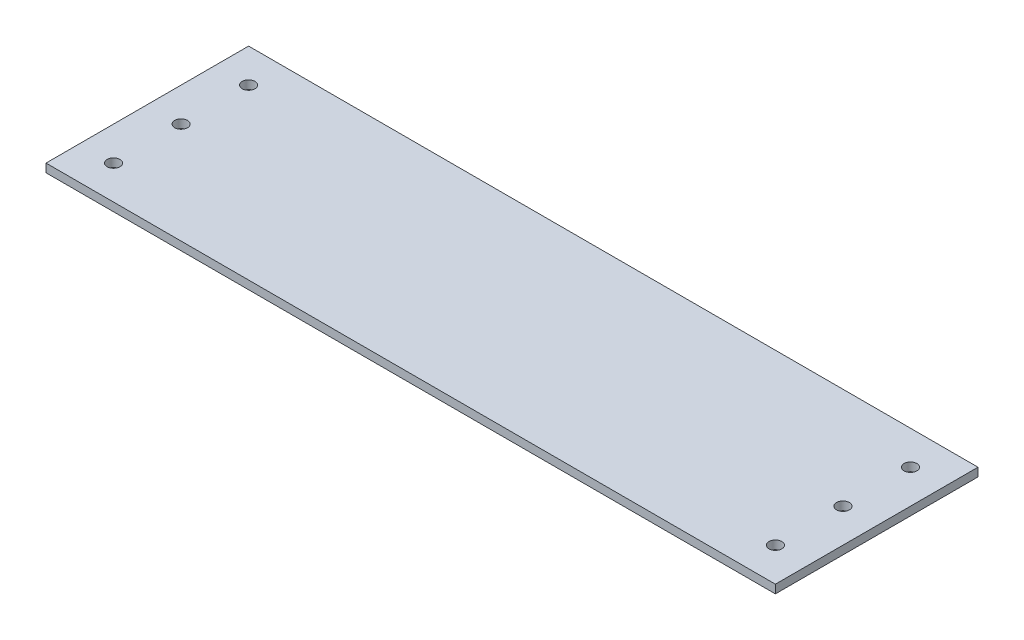
ISO-10303-21;
HEADER;
FILE_DESCRIPTION(('STEP AP214'),'2;1');
FILE_NAME('part.step','',(''),(''),'','','');
FILE_SCHEMA(('AUTOMOTIVE_DESIGN { 1 0 10303 214 1 1 1 1 }'));
ENDSEC;
DATA;
#1=APPLICATION_CONTEXT('core data for automotive mechanical design processes');
#2=APPLICATION_PROTOCOL_DEFINITION('international standard','automotive_design',2000,#1);
#3=PRODUCT_CONTEXT('',#1,'mechanical');
#4=PRODUCT('Part','Part','',(#3));
#5=PRODUCT_RELATED_PRODUCT_CATEGORY('part','',(#4));
#6=PRODUCT_DEFINITION_FORMATION('','',#4);
#7=PRODUCT_DEFINITION_CONTEXT('part definition',#1,'design');
#8=PRODUCT_DEFINITION('design','',#6,#7);
#9=PRODUCT_DEFINITION_SHAPE('','',#8);
#10=(LENGTH_UNIT() NAMED_UNIT(*) SI_UNIT(.MILLI.,.METRE.));
#11=(NAMED_UNIT(*) PLANE_ANGLE_UNIT() SI_UNIT($,.RADIAN.));
#12=(NAMED_UNIT(*) SI_UNIT($,.STERADIAN.) SOLID_ANGLE_UNIT());
#13=UNCERTAINTY_MEASURE_WITH_UNIT(LENGTH_MEASURE(1.E-05),#10,'distance_accuracy_value','');
#14=(GEOMETRIC_REPRESENTATION_CONTEXT(3) GLOBAL_UNCERTAINTY_ASSIGNED_CONTEXT((#13)) GLOBAL_UNIT_ASSIGNED_CONTEXT((#10,
#11,#12)) REPRESENTATION_CONTEXT('',''));
#15=CARTESIAN_POINT('',(0.,0.,0.));
#16=DIRECTION('',(0.,0.,1.));
#17=DIRECTION('',(1.,0.,0.));
#18=AXIS2_PLACEMENT_3D('',#15,#16,#17);
#19=CARTESIAN_POINT('',(0.,3.175,0.));
#20=DIRECTION('',(0.,-1.,0.));
#21=DIRECTION('',(0.,0.,-1.));
#22=AXIS2_PLACEMENT_3D('',#19,#20,#21);
#23=PLANE('',#22);
#24=DIRECTION('',(0.,0.,1.));
#25=VECTOR('',#24,1.);
#26=CARTESIAN_POINT('',(0.,3.175,0.));
#27=LINE('',#26,#25);
#28=CARTESIAN_POINT('',(0.,3.175,-76.2));
#29=VERTEX_POINT('',#28);
#30=CARTESIAN_POINT('',(0.,3.175,0.));
#31=VERTEX_POINT('',#30);
#32=EDGE_CURVE('E92',#29,#31,#27,.T.);
#33=ORIENTED_EDGE('',*,*,#32,.T.);
#34=DIRECTION('',(1.,0.,0.));
#35=VECTOR('',#34,1.);
#36=CARTESIAN_POINT('',(0.,3.175,0.));
#37=LINE('',#36,#35);
#38=CARTESIAN_POINT('',(274.32,3.175,0.));
#39=VERTEX_POINT('',#38);
#40=EDGE_CURVE('E87',#31,#39,#37,.T.);
#41=ORIENTED_EDGE('',*,*,#40,.T.);
#42=DIRECTION('',(0.,0.,-1.));
#43=VECTOR('',#42,1.);
#44=CARTESIAN_POINT('',(274.32,3.175,0.));
#45=LINE('',#44,#43);
#46=CARTESIAN_POINT('',(274.32,3.175,-76.2));
#47=VERTEX_POINT('',#46);
#48=EDGE_CURVE('E90',#39,#47,#45,.T.);
#49=ORIENTED_EDGE('',*,*,#48,.T.);
#50=DIRECTION('',(-1.,0.,0.));
#51=VECTOR('',#50,1.);
#52=CARTESIAN_POINT('',(0.,3.175,-76.2));
#53=LINE('',#52,#51);
#54=EDGE_CURVE('E57',#47,#29,#53,.T.);
#55=ORIENTED_EDGE('',*,*,#54,.T.);
#56=EDGE_LOOP('',(#33,#41,#49,#55));
#57=FACE_BOUND('',#56,.T.);
#58=CARTESIAN_POINT('',(12.7,3.175,-63.5));
#59=DIRECTION('',(0.,1.,0.));
#60=DIRECTION('',(0.,0.,1.));
#61=AXIS2_PLACEMENT_3D('',#58,#59,#60);
#62=CIRCLE('',#61,2.413);
#63=CARTESIAN_POINT('',(12.7,3.175,-61.087));
#64=VERTEX_POINT('',#63);
#65=EDGE_CURVE('E112',#64,#64,#62,.T.);
#66=ORIENTED_EDGE('',*,*,#65,.F.);
#67=EDGE_LOOP('',(#66));
#68=FACE_BOUND('',#67,.T.);
#69=CARTESIAN_POINT('',(12.7000000000003,3.175,-38.1));
#70=DIRECTION('',(0.,1.,0.));
#71=DIRECTION('',(0.,0.,1.));
#72=AXIS2_PLACEMENT_3D('',#69,#70,#71);
#73=CIRCLE('',#72,2.413);
#74=CARTESIAN_POINT('',(12.7000000000003,3.175,-35.687));
#75=VERTEX_POINT('',#74);
#76=EDGE_CURVE('E134',#75,#75,#73,.T.);
#77=ORIENTED_EDGE('',*,*,#76,.F.);
#78=EDGE_LOOP('',(#77));
#79=FACE_BOUND('',#78,.T.);
#80=CARTESIAN_POINT('',(12.7000000000005,3.175,-12.7));
#81=DIRECTION('',(0.,1.,0.));
#82=DIRECTION('',(0.,0.,1.));
#83=AXIS2_PLACEMENT_3D('',#80,#81,#82);
#84=CIRCLE('',#83,2.413);
#85=CARTESIAN_POINT('',(12.7000000000005,3.175,-10.287));
#86=VERTEX_POINT('',#85);
#87=EDGE_CURVE('E142',#86,#86,#84,.T.);
#88=ORIENTED_EDGE('',*,*,#87,.F.);
#89=EDGE_LOOP('',(#88));
#90=FACE_BOUND('',#89,.T.);
#91=CARTESIAN_POINT('',(261.619999999999,3.175,-12.7));
#92=DIRECTION('',(0.,1.,0.));
#93=DIRECTION('',(0.,0.,-1.));
#94=AXIS2_PLACEMENT_3D('',#91,#92,#93);
#95=CIRCLE('',#94,2.41299999999994);
#96=CARTESIAN_POINT('',(261.619999999999,3.175,-15.1129999999999));
#97=VERTEX_POINT('',#96);
#98=EDGE_CURVE('E150',#97,#97,#95,.T.);
#99=ORIENTED_EDGE('',*,*,#98,.F.);
#100=EDGE_LOOP('',(#99));
#101=FACE_BOUND('',#100,.T.);
#102=CARTESIAN_POINT('',(261.62,3.175,-38.1));
#103=DIRECTION('',(0.,1.,0.));
#104=DIRECTION('',(0.,0.,-1.));
#105=AXIS2_PLACEMENT_3D('',#102,#103,#104);
#106=CIRCLE('',#105,2.41299999999999);
#107=CARTESIAN_POINT('',(261.62,3.175,-40.513));
#108=VERTEX_POINT('',#107);
#109=EDGE_CURVE('E158',#108,#108,#106,.T.);
#110=ORIENTED_EDGE('',*,*,#109,.F.);
#111=EDGE_LOOP('',(#110));
#112=FACE_BOUND('',#111,.T.);
#113=CARTESIAN_POINT('',(261.62,3.175,-63.5));
#114=DIRECTION('',(0.,1.,0.));
#115=DIRECTION('',(0.,0.,-1.));
#116=AXIS2_PLACEMENT_3D('',#113,#114,#115);
#117=CIRCLE('',#116,2.41299999999999);
#118=CARTESIAN_POINT('',(261.62,3.175,-65.913));
#119=VERTEX_POINT('',#118);
#120=EDGE_CURVE('E166',#119,#119,#117,.T.);
#121=ORIENTED_EDGE('',*,*,#120,.F.);
#122=EDGE_LOOP('',(#121));
#123=FACE_BOUND('',#122,.T.);
#124=ADVANCED_FACE('F39',(#57,#68,#79,#90,#101,#112,#123),#23,.F.);
#125=CARTESIAN_POINT('',(0.,0.,0.));
#126=DIRECTION('',(0.,-1.,0.));
#127=DIRECTION('',(0.,0.,-1.));
#128=AXIS2_PLACEMENT_3D('',#125,#126,#127);
#129=PLANE('',#128);
#130=CARTESIAN_POINT('',(261.62,0.,-38.1));
#131=DIRECTION('',(0.,1.,0.));
#132=DIRECTION('',(0.,0.,-1.));
#133=AXIS2_PLACEMENT_3D('',#130,#131,#132);
#134=CIRCLE('',#133,2.41299999999999);
#135=CARTESIAN_POINT('',(261.62,0.,-40.513));
#136=VERTEX_POINT('',#135);
#137=EDGE_CURVE('E162',#136,#136,#134,.T.);
#138=ORIENTED_EDGE('',*,*,#137,.T.);
#139=EDGE_LOOP('',(#138));
#140=FACE_BOUND('',#139,.T.);
#141=CARTESIAN_POINT('',(12.7000000000005,0.,-12.7));
#142=DIRECTION('',(0.,1.,0.));
#143=DIRECTION('',(0.,0.,1.));
#144=AXIS2_PLACEMENT_3D('',#141,#142,#143);
#145=CIRCLE('',#144,2.413);
#146=CARTESIAN_POINT('',(12.7000000000005,0.,-10.287));
#147=VERTEX_POINT('',#146);
#148=EDGE_CURVE('E146',#147,#147,#145,.T.);
#149=ORIENTED_EDGE('',*,*,#148,.T.);
#150=EDGE_LOOP('',(#149));
#151=FACE_BOUND('',#150,.T.);
#152=CARTESIAN_POINT('',(12.7,0.,-63.5));
#153=DIRECTION('',(0.,1.,0.));
#154=DIRECTION('',(0.,0.,1.));
#155=AXIS2_PLACEMENT_3D('',#152,#153,#154);
#156=CIRCLE('',#155,2.413);
#157=CARTESIAN_POINT('',(12.7,0.,-61.087));
#158=VERTEX_POINT('',#157);
#159=EDGE_CURVE('E130',#158,#158,#156,.T.);
#160=ORIENTED_EDGE('',*,*,#159,.T.);
#161=EDGE_LOOP('',(#160));
#162=FACE_BOUND('',#161,.T.);
#163=DIRECTION('',(0.,0.,1.));
#164=VECTOR('',#163,1.);
#165=CARTESIAN_POINT('',(0.,0.,0.));
#166=LINE('',#165,#164);
#167=CARTESIAN_POINT('',(0.,0.,-76.2));
#168=VERTEX_POINT('',#167);
#169=CARTESIAN_POINT('',(0.,0.,0.));
#170=VERTEX_POINT('',#169);
#171=EDGE_CURVE('E108',#168,#170,#166,.T.);
#172=ORIENTED_EDGE('',*,*,#171,.F.);
#173=DIRECTION('',(-1.,0.,0.));
#174=VECTOR('',#173,1.);
#175=CARTESIAN_POINT('',(0.,0.,-76.2));
#176=LINE('',#175,#174);
#177=CARTESIAN_POINT('',(274.32,0.,-76.2));
#178=VERTEX_POINT('',#177);
#179=EDGE_CURVE('E80',#178,#168,#176,.T.);
#180=ORIENTED_EDGE('',*,*,#179,.F.);
#181=DIRECTION('',(0.,0.,-1.));
#182=VECTOR('',#181,1.);
#183=CARTESIAN_POINT('',(274.32,0.,0.));
#184=LINE('',#183,#182);
#185=CARTESIAN_POINT('',(274.32,0.,0.));
#186=VERTEX_POINT('',#185);
#187=EDGE_CURVE('E74',#186,#178,#184,.T.);
#188=ORIENTED_EDGE('',*,*,#187,.F.);
#189=DIRECTION('',(1.,0.,0.));
#190=VECTOR('',#189,1.);
#191=CARTESIAN_POINT('',(0.,0.,0.));
#192=LINE('',#191,#190);
#193=EDGE_CURVE('E97',#170,#186,#192,.T.);
#194=ORIENTED_EDGE('',*,*,#193,.F.);
#195=EDGE_LOOP('',(#172,#180,#188,#194));
#196=FACE_BOUND('',#195,.T.);
#197=CARTESIAN_POINT('',(12.7000000000003,0.,-38.1));
#198=DIRECTION('',(0.,1.,0.));
#199=DIRECTION('',(0.,0.,1.));
#200=AXIS2_PLACEMENT_3D('',#197,#198,#199);
#201=CIRCLE('',#200,2.413);
#202=CARTESIAN_POINT('',(12.7000000000003,0.,-35.687));
#203=VERTEX_POINT('',#202);
#204=EDGE_CURVE('E138',#203,#203,#201,.T.);
#205=ORIENTED_EDGE('',*,*,#204,.T.);
#206=EDGE_LOOP('',(#205));
#207=FACE_BOUND('',#206,.T.);
#208=CARTESIAN_POINT('',(261.619999999999,0.,-12.7));
#209=DIRECTION('',(0.,1.,0.));
#210=DIRECTION('',(0.,0.,-1.));
#211=AXIS2_PLACEMENT_3D('',#208,#209,#210);
#212=CIRCLE('',#211,2.41299999999994);
#213=CARTESIAN_POINT('',(261.619999999999,0.,-15.1129999999999));
#214=VERTEX_POINT('',#213);
#215=EDGE_CURVE('E154',#214,#214,#212,.T.);
#216=ORIENTED_EDGE('',*,*,#215,.T.);
#217=EDGE_LOOP('',(#216));
#218=FACE_BOUND('',#217,.T.);
#219=CARTESIAN_POINT('',(261.62,0.,-63.5));
#220=DIRECTION('',(0.,1.,0.));
#221=DIRECTION('',(0.,0.,-1.));
#222=AXIS2_PLACEMENT_3D('',#219,#220,#221);
#223=CIRCLE('',#222,2.41299999999999);
#224=CARTESIAN_POINT('',(261.62,0.,-65.913));
#225=VERTEX_POINT('',#224);
#226=EDGE_CURVE('E170',#225,#225,#223,.T.);
#227=ORIENTED_EDGE('',*,*,#226,.T.);
#228=EDGE_LOOP('',(#227));
#229=FACE_BOUND('',#228,.T.);
#230=ADVANCED_FACE('F125',(#140,#151,#162,#196,#207,#218,#229),#129,.T.);
#231=CARTESIAN_POINT('',(0.,3.175,0.));
#232=DIRECTION('',(1.,0.,0.));
#233=DIRECTION('',(0.,0.,-1.));
#234=AXIS2_PLACEMENT_3D('',#231,#232,#233);
#235=PLANE('',#234);
#236=ORIENTED_EDGE('',*,*,#171,.T.);
#237=DIRECTION('',(0.,-1.,0.));
#238=VECTOR('',#237,1.);
#239=CARTESIAN_POINT('',(0.,3.175,0.));
#240=LINE('',#239,#238);
#241=EDGE_CURVE('E11',#31,#170,#240,.T.);
#242=ORIENTED_EDGE('',*,*,#241,.F.);
#243=ORIENTED_EDGE('',*,*,#32,.F.);
#244=DIRECTION('',(0.,-1.,0.));
#245=VECTOR('',#244,1.);
#246=CARTESIAN_POINT('',(0.,3.175,-76.2));
#247=LINE('',#246,#245);
#248=EDGE_CURVE('E104',#29,#168,#247,.T.);
#249=ORIENTED_EDGE('',*,*,#248,.T.);
#250=EDGE_LOOP('',(#236,#242,#243,#249));
#251=FACE_BOUND('',#250,.T.);
#252=ADVANCED_FACE('F41',(#251),#235,.F.);
#253=CARTESIAN_POINT('',(0.,3.175,0.));
#254=DIRECTION('',(0.,0.,-1.));
#255=DIRECTION('',(-1.,0.,0.));
#256=AXIS2_PLACEMENT_3D('',#253,#254,#255);
#257=PLANE('',#256);
#258=ORIENTED_EDGE('',*,*,#193,.T.);
#259=DIRECTION('',(0.,-1.,0.));
#260=VECTOR('',#259,1.);
#261=CARTESIAN_POINT('',(274.32,3.175,0.));
#262=LINE('',#261,#260);
#263=EDGE_CURVE('E49',#39,#186,#262,.T.);
#264=ORIENTED_EDGE('',*,*,#263,.F.);
#265=ORIENTED_EDGE('',*,*,#40,.F.);
#266=ORIENTED_EDGE('',*,*,#241,.T.);
#267=EDGE_LOOP('',(#258,#264,#265,#266));
#268=FACE_BOUND('',#267,.T.);
#269=ADVANCED_FACE('F96',(#268),#257,.F.);
#270=CARTESIAN_POINT('',(274.32,3.175,0.));
#271=DIRECTION('',(-1.,0.,0.));
#272=DIRECTION('',(0.,0.,1.));
#273=AXIS2_PLACEMENT_3D('',#270,#271,#272);
#274=PLANE('',#273);
#275=ORIENTED_EDGE('',*,*,#187,.T.);
#276=DIRECTION('',(0.,-1.,0.));
#277=VECTOR('',#276,1.);
#278=CARTESIAN_POINT('',(274.32,3.175,-76.2));
#279=LINE('',#278,#277);
#280=EDGE_CURVE('E99',#47,#178,#279,.T.);
#281=ORIENTED_EDGE('',*,*,#280,.F.);
#282=ORIENTED_EDGE('',*,*,#48,.F.);
#283=ORIENTED_EDGE('',*,*,#263,.T.);
#284=EDGE_LOOP('',(#275,#281,#282,#283));
#285=FACE_BOUND('',#284,.T.);
#286=ADVANCED_FACE('F100',(#285),#274,.F.);
#287=CARTESIAN_POINT('',(0.,3.175,-76.2));
#288=DIRECTION('',(0.,0.,1.));
#289=DIRECTION('',(1.,0.,0.));
#290=AXIS2_PLACEMENT_3D('',#287,#288,#289);
#291=PLANE('',#290);
#292=ORIENTED_EDGE('',*,*,#179,.T.);
#293=ORIENTED_EDGE('',*,*,#248,.F.);
#294=ORIENTED_EDGE('',*,*,#54,.F.);
#295=ORIENTED_EDGE('',*,*,#280,.T.);
#296=EDGE_LOOP('',(#292,#293,#294,#295));
#297=FACE_BOUND('',#296,.T.);
#298=ADVANCED_FACE('F122',(#297),#291,.F.);
#299=CARTESIAN_POINT('',(12.7,3.175,-63.5));
#300=DIRECTION('',(0.,-1.,0.));
#301=DIRECTION('',(0.,0.,-1.));
#302=AXIS2_PLACEMENT_3D('',#299,#300,#301);
#303=CYLINDRICAL_SURFACE('',#302,2.413);
#304=ORIENTED_EDGE('',*,*,#65,.T.);
#305=EDGE_LOOP('',(#304));
#306=FACE_BOUND('',#305,.T.);
#307=ORIENTED_EDGE('',*,*,#159,.F.);
#308=EDGE_LOOP('',(#307));
#309=FACE_BOUND('',#308,.T.);
#310=ADVANCED_FACE('F189',(#306,#309),#303,.F.);
#311=CARTESIAN_POINT('',(12.7000000000003,3.175,-38.1));
#312=DIRECTION('',(0.,-1.,0.));
#313=DIRECTION('',(0.,0.,-1.));
#314=AXIS2_PLACEMENT_3D('',#311,#312,#313);
#315=CYLINDRICAL_SURFACE('',#314,2.413);
#316=ORIENTED_EDGE('',*,*,#76,.T.);
#317=EDGE_LOOP('',(#316));
#318=FACE_BOUND('',#317,.T.);
#319=ORIENTED_EDGE('',*,*,#204,.F.);
#320=EDGE_LOOP('',(#319));
#321=FACE_BOUND('',#320,.T.);
#322=ADVANCED_FACE('F235',(#318,#321),#315,.F.);
#323=CARTESIAN_POINT('',(12.7000000000005,3.175,-12.7));
#324=DIRECTION('',(0.,-1.,0.));
#325=DIRECTION('',(0.,0.,-1.));
#326=AXIS2_PLACEMENT_3D('',#323,#324,#325);
#327=CYLINDRICAL_SURFACE('',#326,2.413);
#328=ORIENTED_EDGE('',*,*,#87,.T.);
#329=EDGE_LOOP('',(#328));
#330=FACE_BOUND('',#329,.T.);
#331=ORIENTED_EDGE('',*,*,#148,.F.);
#332=EDGE_LOOP('',(#331));
#333=FACE_BOUND('',#332,.T.);
#334=ADVANCED_FACE('F243',(#330,#333),#327,.F.);
#335=CARTESIAN_POINT('',(261.619999999999,3.175,-12.7));
#336=DIRECTION('',(0.,-1.,0.));
#337=DIRECTION('',(0.,0.,-1.));
#338=AXIS2_PLACEMENT_3D('',#335,#336,#337);
#339=CYLINDRICAL_SURFACE('',#338,2.41299999999994);
#340=ORIENTED_EDGE('',*,*,#98,.T.);
#341=EDGE_LOOP('',(#340));
#342=FACE_BOUND('',#341,.T.);
#343=ORIENTED_EDGE('',*,*,#215,.F.);
#344=EDGE_LOOP('',(#343));
#345=FACE_BOUND('',#344,.T.);
#346=ADVANCED_FACE('F251',(#342,#345),#339,.F.);
#347=CARTESIAN_POINT('',(261.62,3.175,-38.1));
#348=DIRECTION('',(0.,-1.,0.));
#349=DIRECTION('',(0.,0.,-1.));
#350=AXIS2_PLACEMENT_3D('',#347,#348,#349);
#351=CYLINDRICAL_SURFACE('',#350,2.41299999999999);
#352=ORIENTED_EDGE('',*,*,#109,.T.);
#353=EDGE_LOOP('',(#352));
#354=FACE_BOUND('',#353,.T.);
#355=ORIENTED_EDGE('',*,*,#137,.F.);
#356=EDGE_LOOP('',(#355));
#357=FACE_BOUND('',#356,.T.);
#358=ADVANCED_FACE('F260',(#354,#357),#351,.F.);
#359=CARTESIAN_POINT('',(261.62,3.175,-63.5));
#360=DIRECTION('',(0.,-1.,0.));
#361=DIRECTION('',(0.,0.,-1.));
#362=AXIS2_PLACEMENT_3D('',#359,#360,#361);
#363=CYLINDRICAL_SURFACE('',#362,2.41299999999999);
#364=ORIENTED_EDGE('',*,*,#120,.T.);
#365=EDGE_LOOP('',(#364));
#366=FACE_BOUND('',#365,.T.);
#367=ORIENTED_EDGE('',*,*,#226,.F.);
#368=EDGE_LOOP('',(#367));
#369=FACE_BOUND('',#368,.T.);
#370=ADVANCED_FACE('F178',(#366,#369),#363,.F.);
#371=CLOSED_SHELL('',(#124,#230,#252,#269,#286,#298,#310,#322,#334,#346,#358,#370));
#372=MANIFOLD_SOLID_BREP('B2',#371);
#373=ADVANCED_BREP_SHAPE_REPRESENTATION('',(#18,#372),#14);
#374=SHAPE_DEFINITION_REPRESENTATION(#9,#373);
ENDSEC;
END-ISO-10303-21;
